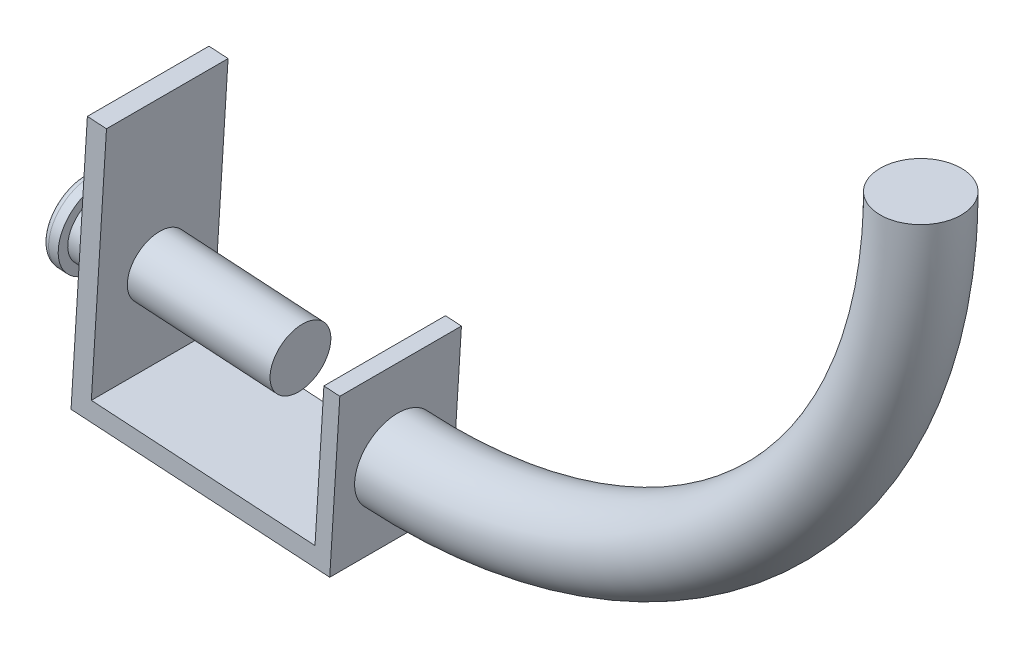
ISO-10303-21;
HEADER;
FILE_DESCRIPTION(('STEP AP214'),'2;1');
FILE_NAME('part.step','',(''),(''),'','','');
FILE_SCHEMA(('AUTOMOTIVE_DESIGN { 1 0 10303 214 1 1 1 1 }'));
ENDSEC;
DATA;
#1=APPLICATION_CONTEXT('core data for automotive mechanical design processes');
#2=APPLICATION_PROTOCOL_DEFINITION('international standard','automotive_design',2000,#1);
#3=PRODUCT_CONTEXT('',#1,'mechanical');
#4=PRODUCT('Part','Part','',(#3));
#5=PRODUCT_RELATED_PRODUCT_CATEGORY('part','',(#4));
#6=PRODUCT_DEFINITION_FORMATION('','',#4);
#7=PRODUCT_DEFINITION_CONTEXT('part definition',#1,'design');
#8=PRODUCT_DEFINITION('design','',#6,#7);
#9=PRODUCT_DEFINITION_SHAPE('','',#8);
#10=(LENGTH_UNIT() NAMED_UNIT(*) SI_UNIT(.MILLI.,.METRE.));
#11=(NAMED_UNIT(*) PLANE_ANGLE_UNIT() SI_UNIT($,.RADIAN.));
#12=(NAMED_UNIT(*) SI_UNIT($,.STERADIAN.) SOLID_ANGLE_UNIT());
#13=UNCERTAINTY_MEASURE_WITH_UNIT(LENGTH_MEASURE(1.E-05),#10,'distance_accuracy_value','');
#14=(GEOMETRIC_REPRESENTATION_CONTEXT(3) GLOBAL_UNCERTAINTY_ASSIGNED_CONTEXT((#13)) GLOBAL_UNIT_ASSIGNED_CONTEXT((#10,
#11,#12)) REPRESENTATION_CONTEXT('',''));
#15=CARTESIAN_POINT('',(0.,0.,0.));
#16=DIRECTION('',(0.,0.,1.));
#17=DIRECTION('',(1.,0.,0.));
#18=AXIS2_PLACEMENT_3D('',#15,#16,#17);
#19=CARTESIAN_POINT('',(-91.7773828523541,-167.141237974813,-19.05));
#20=DIRECTION('',(-0.0622201883692814,-0.998062447023878,0.));
#21=DIRECTION('',(0.998062447023878,-0.0622201883692814,0.));
#22=AXIS2_PLACEMENT_3D('',#19,#20,#21);
#23=PLANE('',#22);
#24=DIRECTION('',(0.,0.,-1.));
#25=VECTOR('',#24,1.);
#26=CARTESIAN_POINT('',(-85.7890081702108,-167.514559105029,19.05));
#27=LINE('',#26,#25);
#28=CARTESIAN_POINT('',(-85.7890081702108,-167.514559105029,19.05));
#29=VERTEX_POINT('',#28);
#30=CARTESIAN_POINT('',(-85.7890081702108,-167.514559105029,-19.05));
#31=VERTEX_POINT('',#30);
#32=EDGE_CURVE('E137',#29,#31,#27,.T.);
#33=ORIENTED_EDGE('',*,*,#32,.F.);
#34=DIRECTION('',(0.998062447023878,-0.0622201883692814,0.));
#35=VECTOR('',#34,1.);
#36=CARTESIAN_POINT('',(-91.7773828523541,-167.141237974813,19.05));
#37=LINE('',#36,#35);
#38=CARTESIAN_POINT('',(-15.7250243891345,-171.882416328552,19.05));
#39=VERTEX_POINT('',#38);
#40=EDGE_CURVE('E61',#29,#39,#37,.T.);
#41=ORIENTED_EDGE('',*,*,#40,.T.);
#42=DIRECTION('',(0.,0.,-1.));
#43=VECTOR('',#42,1.);
#44=CARTESIAN_POINT('',(-15.7250243891345,-171.882416328552,-19.05));
#45=LINE('',#44,#43);
#46=CARTESIAN_POINT('',(-15.7250243891345,-171.882416328552,-19.05));
#47=VERTEX_POINT('',#46);
#48=EDGE_CURVE('E142',#39,#47,#45,.T.);
#49=ORIENTED_EDGE('',*,*,#48,.T.);
#50=DIRECTION('',(0.998062447023878,-0.0622201883692814,0.));
#51=VECTOR('',#50,1.);
#52=CARTESIAN_POINT('',(-91.7773828523541,-167.141237974813,-19.05));
#53=LINE('',#52,#51);
#54=EDGE_CURVE('E159',#31,#47,#53,.T.);
#55=ORIENTED_EDGE('',*,*,#54,.F.);
#56=EDGE_LOOP('',(#33,#41,#49,#55));
#57=FACE_BOUND('',#56,.T.);
#58=ADVANCED_FACE('F45',(#57),#23,.F.);
#59=CARTESIAN_POINT('',(155.,0.,0.));
#60=DIRECTION('',(0.,1.,0.));
#61=DIRECTION('',(-1.,0.,0.));
#62=AXIS2_PLACEMENT_3D('',#59,#60,#61);
#63=PLANE('',#62);
#64=CARTESIAN_POINT('',(155.,0.,0.));
#65=DIRECTION('',(0.,1.,0.));
#66=DIRECTION('',(-1.,0.,0.));
#67=AXIS2_PLACEMENT_3D('',#64,#65,#66);
#68=CIRCLE('',#67,12.7);
#69=CARTESIAN_POINT('',(142.3,0.,0.));
#70=VERTEX_POINT('',#69);
#71=EDGE_CURVE('E67',#70,#70,#68,.T.);
#72=ORIENTED_EDGE('',*,*,#71,.T.);
#73=EDGE_LOOP('',(#72));
#74=FACE_BOUND('',#73,.T.);
#75=ADVANCED_FACE('F256',(#74),#63,.T.);
#76=CARTESIAN_POINT('',(0.,0.,0.));
#77=DIRECTION('',(0.,0.,1.));
#78=DIRECTION('',(1.,0.,0.));
#79=AXIS2_PLACEMENT_3D('',#76,#77,#78);
#80=TOROIDAL_SURFACE('',#79,155.,12.7);
#81=ORIENTED_EDGE('',*,*,#71,.F.);
#82=EDGE_LOOP('',(#81));
#83=FACE_BOUND('',#82,.T.);
#84=CARTESIAN_POINT('',(-9.64412919723861,-154.699679288701,0.));
#85=DIRECTION('',(-0.998062447023878,0.0622201883692814,0.));
#86=DIRECTION('',(-0.0622201883692814,-0.998062447023878,0.));
#87=AXIS2_PLACEMENT_3D('',#84,#85,#86);
#88=CIRCLE('',#87,12.7);
#89=CARTESIAN_POINT('',(-10.4343255895285,-167.375072365904,0.));
#90=VERTEX_POINT('',#89);
#91=EDGE_CURVE('E203',#90,#90,#88,.F.);
#92=ORIENTED_EDGE('',*,*,#91,.T.);
#93=EDGE_LOOP('',(#92));
#94=FACE_BOUND('',#93,.T.);
#95=ADVANCED_FACE('F258',(#83,#94),#80,.T.);
#96=CARTESIAN_POINT('',(-12.9375599501907,-127.169218701883,-19.05));
#97=DIRECTION('',(0.,0.,1.));
#98=DIRECTION('',(0.,-1.,0.));
#99=AXIS2_PLACEMENT_3D('',#96,#97,#98);
#100=PLANE('',#99);
#101=DIRECTION('',(-0.0622201883692814,-0.998062447023878,0.));
#102=VECTOR('',#101,1.);
#103=CARTESIAN_POINT('',(-7.94724771507135,-127.480319643729,-19.05));
#104=LINE('',#103,#102);
#105=CARTESIAN_POINT('',(-7.94724771507135,-127.480319643729,-19.05));
#106=VERTEX_POINT('',#105);
#107=CARTESIAN_POINT('',(-11.1080332842308,-178.181891952542,-19.05));
#108=VERTEX_POINT('',#107);
#109=EDGE_CURVE('E165',#106,#108,#104,.T.);
#110=ORIENTED_EDGE('',*,*,#109,.T.);
#111=DIRECTION('',(0.998062447023878,-0.0622201883692814,0.));
#112=VECTOR('',#111,1.);
#113=CARTESIAN_POINT('',(-16.0983455193502,-177.870791010696,-19.05));
#114=LINE('',#113,#112);
#115=CARTESIAN_POINT('',(-92.1507039825698,-173.129612656957,-19.05));
#116=VERTEX_POINT('',#115);
#117=EDGE_CURVE('E199',#116,#108,#114,.T.);
#118=ORIENTED_EDGE('',*,*,#117,.F.);
#119=DIRECTION('',(-0.0622201883692813,-0.998062447023878,0.));
#120=VECTOR('',#119,1.);
#121=CARTESIAN_POINT('',(-91.7773828523541,-167.141237974813,-19.05));
#122=LINE('',#121,#120);
#123=CARTESIAN_POINT('',(-87.0362044986148,-91.0888795115937,-19.05));
#124=VERTEX_POINT('',#123);
#125=EDGE_CURVE('E122',#124,#116,#122,.T.);
#126=ORIENTED_EDGE('',*,*,#125,.F.);
#127=DIRECTION('',(-0.998062447023878,0.0622201883692847,0.));
#128=VECTOR('',#127,1.);
#129=CARTESIAN_POINT('',(-81.0478298164715,-91.4622006418094,-19.05));
#130=LINE('',#129,#128);
#131=CARTESIAN_POINT('',(-81.0478298164715,-91.4622006418094,-19.05));
#132=VERTEX_POINT('',#131);
#133=EDGE_CURVE('E114',#132,#124,#130,.T.);
#134=ORIENTED_EDGE('',*,*,#133,.F.);
#135=DIRECTION('',(-0.0622201883692814,-0.998062447023878,0.));
#136=VECTOR('',#135,1.);
#137=CARTESIAN_POINT('',(-81.0478298164715,-91.4622006418094,-19.05));
#138=LINE('',#137,#136);
#139=EDGE_CURVE('E119',#132,#31,#138,.T.);
#140=ORIENTED_EDGE('',*,*,#139,.T.);
#141=ORIENTED_EDGE('',*,*,#54,.T.);
#142=DIRECTION('',(-0.0622201883692814,-0.998062447023878,0.));
#143=VECTOR('',#142,1.);
#144=CARTESIAN_POINT('',(-12.9375599501907,-127.169218701883,-19.05));
#145=LINE('',#144,#143);
#146=CARTESIAN_POINT('',(-12.9375599501907,-127.169218701883,-19.05));
#147=VERTEX_POINT('',#146);
#148=EDGE_CURVE('E166',#147,#47,#145,.T.);
#149=ORIENTED_EDGE('',*,*,#148,.F.);
#150=DIRECTION('',(0.998062447023878,-0.0622201883692814,0.));
#151=VECTOR('',#150,1.);
#152=CARTESIAN_POINT('',(-12.9375599501907,-127.169218701883,-19.05));
#153=LINE('',#152,#151);
#154=EDGE_CURVE('E177',#147,#106,#153,.T.);
#155=ORIENTED_EDGE('',*,*,#154,.T.);
#156=EDGE_LOOP('',(#110,#118,#126,#134,#140,#141,#149,#155));
#157=FACE_BOUND('',#156,.T.);
#158=ADVANCED_FACE('F117',(#157),#100,.F.);
#159=CARTESIAN_POINT('',(-16.0983455193502,-177.870791010696,-19.05));
#160=DIRECTION('',(0.0622201883692814,0.998062447023878,0.));
#161=DIRECTION('',(-0.998062447023878,0.0622201883692814,0.));
#162=AXIS2_PLACEMENT_3D('',#159,#160,#161);
#163=PLANE('',#162);
#164=DIRECTION('',(0.,0.,1.));
#165=VECTOR('',#164,1.);
#166=CARTESIAN_POINT('',(-11.1080332842308,-178.181891952542,-19.05));
#167=LINE('',#166,#165);
#168=CARTESIAN_POINT('',(-11.1080332842308,-178.181891952542,19.05));
#169=VERTEX_POINT('',#168);
#170=EDGE_CURVE('E180',#108,#169,#167,.T.);
#171=ORIENTED_EDGE('',*,*,#170,.T.);
#172=DIRECTION('',(0.998062447023878,-0.0622201883692814,0.));
#173=VECTOR('',#172,1.);
#174=CARTESIAN_POINT('',(-16.0983455193502,-177.870791010696,19.05));
#175=LINE('',#174,#173);
#176=CARTESIAN_POINT('',(-92.1507039825698,-173.129612656957,19.05));
#177=VERTEX_POINT('',#176);
#178=EDGE_CURVE('E195',#177,#169,#175,.T.);
#179=ORIENTED_EDGE('',*,*,#178,.F.);
#180=DIRECTION('',(0.,0.,1.));
#181=VECTOR('',#180,1.);
#182=CARTESIAN_POINT('',(-92.1507039825698,-173.129612656957,-19.05));
#183=LINE('',#182,#181);
#184=EDGE_CURVE('E153',#116,#177,#183,.T.);
#185=ORIENTED_EDGE('',*,*,#184,.F.);
#186=ORIENTED_EDGE('',*,*,#117,.T.);
#187=EDGE_LOOP('',(#171,#179,#185,#186));
#188=FACE_BOUND('',#187,.T.);
#189=ADVANCED_FACE('F270',(#188),#163,.F.);
#190=CARTESIAN_POINT('',(-12.9375599501907,-127.169218701883,19.05));
#191=DIRECTION('',(0.,0.,-1.));
#192=DIRECTION('',(0.,1.,0.));
#193=AXIS2_PLACEMENT_3D('',#190,#191,#192);
#194=PLANE('',#193);
#195=DIRECTION('',(0.0622201883692814,0.998062447023878,0.));
#196=VECTOR('',#195,1.);
#197=CARTESIAN_POINT('',(-7.94724771507135,-127.480319643729,19.05));
#198=LINE('',#197,#196);
#199=CARTESIAN_POINT('',(-7.94724771507135,-127.480319643729,19.05));
#200=VERTEX_POINT('',#199);
#201=EDGE_CURVE('E183',#169,#200,#198,.T.);
#202=ORIENTED_EDGE('',*,*,#201,.T.);
#203=DIRECTION('',(0.998062447023878,-0.0622201883692814,0.));
#204=VECTOR('',#203,1.);
#205=CARTESIAN_POINT('',(-12.9375599501907,-127.169218701883,19.05));
#206=LINE('',#205,#204);
#207=CARTESIAN_POINT('',(-12.9375599501907,-127.169218701883,19.05));
#208=VERTEX_POINT('',#207);
#209=EDGE_CURVE('E191',#208,#200,#206,.T.);
#210=ORIENTED_EDGE('',*,*,#209,.F.);
#211=DIRECTION('',(0.0622201883692814,0.998062447023878,0.));
#212=VECTOR('',#211,1.);
#213=CARTESIAN_POINT('',(-12.9375599501907,-127.169218701883,19.05));
#214=LINE('',#213,#212);
#215=EDGE_CURVE('E170',#39,#208,#214,.T.);
#216=ORIENTED_EDGE('',*,*,#215,.F.);
#217=ORIENTED_EDGE('',*,*,#40,.F.);
#218=DIRECTION('',(-0.0622201883692814,-0.998062447023878,0.));
#219=VECTOR('',#218,1.);
#220=CARTESIAN_POINT('',(-81.0478298164715,-91.4622006418094,19.05));
#221=LINE('',#220,#219);
#222=CARTESIAN_POINT('',(-81.0478298164715,-91.4622006418094,19.05));
#223=VERTEX_POINT('',#222);
#224=EDGE_CURVE('E143',#223,#29,#221,.T.);
#225=ORIENTED_EDGE('',*,*,#224,.F.);
#226=DIRECTION('',(0.998062447023878,-0.0622201883692847,0.));
#227=VECTOR('',#226,1.);
#228=CARTESIAN_POINT('',(-81.0478298164715,-91.4622006418094,19.05));
#229=LINE('',#228,#227);
#230=CARTESIAN_POINT('',(-87.0362044986148,-91.0888795115937,19.05));
#231=VERTEX_POINT('',#230);
#232=EDGE_CURVE('E133',#231,#223,#229,.T.);
#233=ORIENTED_EDGE('',*,*,#232,.F.);
#234=DIRECTION('',(0.0622201883692813,0.998062447023878,0.));
#235=VECTOR('',#234,1.);
#236=CARTESIAN_POINT('',(-91.7773828523541,-167.141237974813,19.05));
#237=LINE('',#236,#235);
#238=EDGE_CURVE('E157',#177,#231,#237,.T.);
#239=ORIENTED_EDGE('',*,*,#238,.F.);
#240=ORIENTED_EDGE('',*,*,#178,.T.);
#241=EDGE_LOOP('',(#202,#210,#216,#217,#225,#233,#239,#240));
#242=FACE_BOUND('',#241,.T.);
#243=ADVANCED_FACE('F276',(#242),#194,.F.);
#244=CARTESIAN_POINT('',(-12.9375599501907,-127.169218701883,-19.05));
#245=DIRECTION('',(-0.0622201883692814,-0.998062447023878,0.));
#246=DIRECTION('',(0.998062447023878,-0.0622201883692814,0.));
#247=AXIS2_PLACEMENT_3D('',#244,#245,#246);
#248=PLANE('',#247);
#249=DIRECTION('',(0.,0.,-1.));
#250=VECTOR('',#249,1.);
#251=CARTESIAN_POINT('',(-7.94724771507135,-127.480319643729,-19.05));
#252=LINE('',#251,#250);
#253=EDGE_CURVE('E171',#200,#106,#252,.T.);
#254=ORIENTED_EDGE('',*,*,#253,.T.);
#255=ORIENTED_EDGE('',*,*,#154,.F.);
#256=DIRECTION('',(0.,0.,-1.));
#257=VECTOR('',#256,1.);
#258=CARTESIAN_POINT('',(-12.9375599501907,-127.169218701883,-19.05));
#259=LINE('',#258,#257);
#260=EDGE_CURVE('E174',#208,#147,#259,.T.);
#261=ORIENTED_EDGE('',*,*,#260,.F.);
#262=ORIENTED_EDGE('',*,*,#209,.T.);
#263=EDGE_LOOP('',(#254,#255,#261,#262));
#264=FACE_BOUND('',#263,.T.);
#265=ADVANCED_FACE('F280',(#264),#248,.F.);
#266=CARTESIAN_POINT('',(-4.99031223511939,0.311100941846407,0.));
#267=DIRECTION('',(-0.998062447023878,0.0622201883692814,0.));
#268=DIRECTION('',(-0.0622201883692814,-0.998062447023878,0.));
#269=AXIS2_PLACEMENT_3D('',#266,#267,#268);
#270=PLANE('',#269);
#271=ORIENTED_EDGE('',*,*,#48,.F.);
#272=ORIENTED_EDGE('',*,*,#215,.T.);
#273=ORIENTED_EDGE('',*,*,#260,.T.);
#274=ORIENTED_EDGE('',*,*,#148,.T.);
#275=EDGE_LOOP('',(#271,#272,#273,#274));
#276=FACE_BOUND('',#275,.T.);
#277=ADVANCED_FACE('F284',(#276),#270,.T.);
#278=CARTESIAN_POINT('',(0.,0.,0.));
#279=DIRECTION('',(-0.998062447023878,0.0622201883692814,0.));
#280=DIRECTION('',(-0.0622201883692814,-0.998062447023878,0.));
#281=AXIS2_PLACEMENT_3D('',#278,#279,#280);
#282=PLANE('',#281);
#283=ORIENTED_EDGE('',*,*,#91,.F.);
#284=EDGE_LOOP('',(#283));
#285=FACE_BOUND('',#284,.T.);
#286=ORIENTED_EDGE('',*,*,#109,.F.);
#287=ORIENTED_EDGE('',*,*,#253,.F.);
#288=ORIENTED_EDGE('',*,*,#201,.F.);
#289=ORIENTED_EDGE('',*,*,#170,.F.);
#290=EDGE_LOOP('',(#286,#287,#288,#289));
#291=FACE_BOUND('',#290,.T.);
#292=ADVANCED_FACE('F286',(#285,#291),#282,.F.);
#293=CARTESIAN_POINT('',(-81.0426706983389,5.05227929558565,0.));
#294=DIRECTION('',(-0.998062447023878,0.0622201883692813,0.));
#295=DIRECTION('',(-0.0622201883692813,-0.998062447023878,0.));
#296=AXIS2_PLACEMENT_3D('',#293,#294,#295);
#297=PLANE('',#296);
#298=CARTESIAN_POINT('',(-90.0327069780824,-139.155217392484,0.));
#299=DIRECTION('',(-0.998062447023878,0.0622201883692813,0.));
#300=DIRECTION('',(-0.0622201883692813,-0.998062447023878,0.));
#301=AXIS2_PLACEMENT_3D('',#298,#299,#300);
#302=CIRCLE('',#301,9.50911256806597);
#303=CARTESIAN_POINT('',(-90.6243657532921,-148.645905551193,0.));
#304=VERTEX_POINT('',#303);
#305=EDGE_CURVE('E209',#304,#304,#302,.T.);
#306=ORIENTED_EDGE('',*,*,#305,.F.);
#307=EDGE_LOOP('',(#306));
#308=FACE_BOUND('',#307,.T.);
#309=ORIENTED_EDGE('',*,*,#125,.T.);
#310=ORIENTED_EDGE('',*,*,#184,.T.);
#311=ORIENTED_EDGE('',*,*,#238,.T.);
#312=DIRECTION('',(0.,0.,1.));
#313=VECTOR('',#312,1.);
#314=CARTESIAN_POINT('',(-87.0362044986148,-91.0888795115937,19.05));
#315=LINE('',#314,#313);
#316=EDGE_CURVE('E127',#124,#231,#315,.T.);
#317=ORIENTED_EDGE('',*,*,#316,.F.);
#318=EDGE_LOOP('',(#309,#310,#311,#317));
#319=FACE_BOUND('',#318,.T.);
#320=ADVANCED_FACE('F288',(#308,#319),#297,.T.);
#321=CARTESIAN_POINT('',(-81.0478298164715,-91.4622006418094,19.05));
#322=DIRECTION('',(-0.998062447023878,0.0622201883692814,0.));
#323=DIRECTION('',(-0.0622201883692814,-0.998062447023878,0.));
#324=AXIS2_PLACEMENT_3D('',#321,#322,#323);
#325=PLANE('',#324);
#326=CARTESIAN_POINT('',(-84.0443322959391,-139.5285385227,0.));
#327=DIRECTION('',(-0.998062447023878,0.0622201883692814,0.));
#328=DIRECTION('',(-0.0622201883692814,-0.998062447023878,0.));
#329=AXIS2_PLACEMENT_3D('',#326,#327,#328);
#330=CIRCLE('',#329,9.50911256806597);
#331=CARTESIAN_POINT('',(-84.6359910711489,-149.019226681409,0.));
#332=VERTEX_POINT('',#331);
#333=EDGE_CURVE('E210',#332,#332,#330,.T.);
#334=ORIENTED_EDGE('',*,*,#333,.T.);
#335=EDGE_LOOP('',(#334));
#336=FACE_BOUND('',#335,.T.);
#337=ORIENTED_EDGE('',*,*,#32,.T.);
#338=ORIENTED_EDGE('',*,*,#139,.F.);
#339=DIRECTION('',(0.,0.,-1.));
#340=VECTOR('',#339,1.);
#341=CARTESIAN_POINT('',(-81.0478298164715,-91.4622006418094,19.05));
#342=LINE('',#341,#340);
#343=EDGE_CURVE('E128',#223,#132,#342,.T.);
#344=ORIENTED_EDGE('',*,*,#343,.F.);
#345=ORIENTED_EDGE('',*,*,#224,.T.);
#346=EDGE_LOOP('',(#337,#338,#344,#345));
#347=FACE_BOUND('',#346,.T.);
#348=ADVANCED_FACE('F139',(#336,#347),#325,.F.);
#349=CARTESIAN_POINT('',(-5.9935338002765,-96.1411588071796,0.));
#350=DIRECTION('',(0.0622201883692847,0.998062447023878,0.));
#351=DIRECTION('',(-0.998062447023878,0.0622201883692847,0.));
#352=AXIS2_PLACEMENT_3D('',#349,#350,#351);
#353=PLANE('',#352);
#354=ORIENTED_EDGE('',*,*,#343,.T.);
#355=ORIENTED_EDGE('',*,*,#133,.T.);
#356=ORIENTED_EDGE('',*,*,#316,.T.);
#357=ORIENTED_EDGE('',*,*,#232,.T.);
#358=EDGE_LOOP('',(#354,#355,#356,#357));
#359=FACE_BOUND('',#358,.T.);
#360=ADVANCED_FACE('F131',(#359),#353,.T.);
#361=CARTESIAN_POINT('',(-39.3311346692694,-142.316002961643,0.));
#362=DIRECTION('',(-0.998062447023878,0.0622201883692813,0.));
#363=DIRECTION('',(-0.0622201883692813,-0.998062447023878,0.));
#364=AXIS2_PLACEMENT_3D('',#361,#362,#363);
#365=PLANE('',#364);
#366=CARTESIAN_POINT('',(-39.3311346692694,-142.316002961643,0.));
#367=DIRECTION('',(-0.998062447023878,0.0622201883692813,0.));
#368=DIRECTION('',(-0.0622201883692813,-0.998062447023878,0.));
#369=AXIS2_PLACEMENT_3D('',#366,#367,#368);
#370=CIRCLE('',#369,9.50911256806597);
#371=CARTESIAN_POINT('',(-39.9227934444791,-151.806691120353,0.));
#372=VERTEX_POINT('',#371);
#373=EDGE_CURVE('E213',#372,#372,#370,.T.);
#374=ORIENTED_EDGE('',*,*,#373,.F.);
#375=EDGE_LOOP('',(#374));
#376=FACE_BOUND('',#375,.T.);
#377=ADVANCED_FACE('F316',(#376),#365,.F.);
#378=CARTESIAN_POINT('',(-39.3311346692694,-142.316002961643,0.));
#379=DIRECTION('',(-0.998062447023878,0.0622201883692813,0.));
#380=DIRECTION('',(-0.0622201883692813,-0.998062447023878,0.));
#381=AXIS2_PLACEMENT_3D('',#378,#379,#380);
#382=CYLINDRICAL_SURFACE('',#381,9.50911256806597);
#383=ORIENTED_EDGE('',*,*,#373,.T.);
#384=EDGE_LOOP('',(#383));
#385=FACE_BOUND('',#384,.T.);
#386=ORIENTED_EDGE('',*,*,#333,.F.);
#387=EDGE_LOOP('',(#386));
#388=FACE_BOUND('',#387,.T.);
#389=ADVANCED_FACE('F320',(#385,#388),#382,.T.);
#390=ORIENTED_EDGE('',*,*,#305,.T.);
#391=EDGE_LOOP('',(#390));
#392=FACE_BOUND('',#391,.T.);
#393=CARTESIAN_POINT('',(-102.708100055286,-138.365021000194,0.));
#394=DIRECTION('',(-0.998062447023878,0.0622201883692813,0.));
#395=DIRECTION('',(-0.0622201883692813,-0.998062447023878,0.));
#396=AXIS2_PLACEMENT_3D('',#393,#394,#395);
#397=CIRCLE('',#396,9.50911256806597);
#398=CARTESIAN_POINT('',(-103.299758830495,-147.855709158903,0.));
#399=VERTEX_POINT('',#398);
#400=EDGE_CURVE('E233',#399,#399,#397,.T.);
#401=ORIENTED_EDGE('',*,*,#400,.F.);
#402=EDGE_LOOP('',(#401));
#403=FACE_BOUND('',#402,.T.);
#404=ADVANCED_FACE('F317',(#392,#403),#382,.T.);
#405=CARTESIAN_POINT('',(-107.698412290405,-138.053920058348,0.));
#406=DIRECTION('',(0.998062447023878,-0.0622201883692813,0.));
#407=DIRECTION('',(0.0622201883692813,0.998062447023878,0.));
#408=AXIS2_PLACEMENT_3D('',#405,#406,#407);
#409=CYLINDRICAL_SURFACE('',#408,12.5);
#410=CARTESIAN_POINT('',(-105.702287396357,-138.178360435086,0.));
#411=DIRECTION('',(-0.998062447023878,0.0622201883692813,0.));
#412=DIRECTION('',(-0.0622201883692813,-0.998062447023878,0.));
#413=AXIS2_PLACEMENT_3D('',#410,#411,#412);
#414=CIRCLE('',#413,12.5);
#415=CARTESIAN_POINT('',(-106.480039750973,-150.654141022885,0.));
#416=VERTEX_POINT('',#415);
#417=EDGE_CURVE('E12',#416,#416,#414,.F.);
#418=ORIENTED_EDGE('',*,*,#417,.T.);
#419=EDGE_LOOP('',(#418));
#420=FACE_BOUND('',#419,.T.);
#421=CARTESIAN_POINT('',(-102.708100055286,-138.365021000194,0.));
#422=DIRECTION('',(-0.998062447023878,0.0622201883692813,0.));
#423=DIRECTION('',(-0.0622201883692813,-0.998062447023878,0.));
#424=AXIS2_PLACEMENT_3D('',#421,#422,#423);
#425=CIRCLE('',#424,12.5);
#426=CARTESIAN_POINT('',(-103.485852409902,-150.840801587992,0.));
#427=VERTEX_POINT('',#426);
#428=EDGE_CURVE('E236',#427,#427,#425,.T.);
#429=ORIENTED_EDGE('',*,*,#428,.T.);
#430=EDGE_LOOP('',(#429));
#431=FACE_BOUND('',#430,.T.);
#432=ADVANCED_FACE('F241',(#420,#431),#409,.T.);
#433=CARTESIAN_POINT('',(-107.698412290405,-138.053920058348,0.));
#434=DIRECTION('',(-0.998062447023878,0.0622201883692813,0.));
#435=DIRECTION('',(-0.0622201883692813,-0.998062447023878,0.));
#436=AXIS2_PLACEMENT_3D('',#433,#434,#435);
#437=PLANE('',#436);
#438=CARTESIAN_POINT('',(-107.698412290405,-138.053920058348,0.));
#439=DIRECTION('',(-0.998062447023878,0.0622201883692813,0.));
#440=DIRECTION('',(-0.0622201883692813,-0.998062447023878,0.));
#441=AXIS2_PLACEMENT_3D('',#438,#439,#440);
#442=CIRCLE('',#441,10.5);
#443=CARTESIAN_POINT('',(-108.351724268282,-148.533575752098,0.));
#444=VERTEX_POINT('',#443);
#445=EDGE_CURVE('E54',#444,#444,#442,.T.);
#446=ORIENTED_EDGE('',*,*,#445,.T.);
#447=EDGE_LOOP('',(#446));
#448=FACE_BOUND('',#447,.T.);
#449=ADVANCED_FACE('F245',(#448),#437,.T.);
#450=CARTESIAN_POINT('',(-102.708100055286,-138.365021000194,0.));
#451=DIRECTION('',(-0.998062447023878,0.0622201883692813,0.));
#452=DIRECTION('',(-0.0622201883692813,-0.998062447023878,0.));
#453=AXIS2_PLACEMENT_3D('',#450,#451,#452);
#454=PLANE('',#453);
#455=ORIENTED_EDGE('',*,*,#400,.T.);
#456=EDGE_LOOP('',(#455));
#457=FACE_BOUND('',#456,.T.);
#458=ORIENTED_EDGE('',*,*,#428,.F.);
#459=EDGE_LOOP('',(#458));
#460=FACE_BOUND('',#459,.T.);
#461=ADVANCED_FACE('F243',(#457,#460),#454,.F.);
#462=CARTESIAN_POINT('',(-105.702287396357,-138.178360435086,0.));
#463=DIRECTION('',(-0.998062447023878,0.0622201883692813,0.));
#464=DIRECTION('',(-0.0622201883692813,-0.998062447023878,0.));
#465=AXIS2_PLACEMENT_3D('',#462,#463,#464);
#466=TOROIDAL_SURFACE('',#465,10.5,2.);
#467=ORIENTED_EDGE('',*,*,#417,.F.);
#468=EDGE_LOOP('',(#467));
#469=FACE_BOUND('',#468,.T.);
#470=ORIENTED_EDGE('',*,*,#445,.F.);
#471=EDGE_LOOP('',(#470));
#472=FACE_BOUND('',#471,.T.);
#473=ADVANCED_FACE('F47',(#469,#472),#466,.T.);
#474=CLOSED_SHELL('',(#58,#75,#95,#158,#189,#243,#265,#277,#292,#320,#348,#360,#377,#389,#404,
#432,#449,#461,#473));
#475=MANIFOLD_SOLID_BREP('B2',#474);
#476=ADVANCED_BREP_SHAPE_REPRESENTATION('',(#18,#475),#14);
#477=SHAPE_DEFINITION_REPRESENTATION(#9,#476);
ENDSEC;
END-ISO-10303-21;
